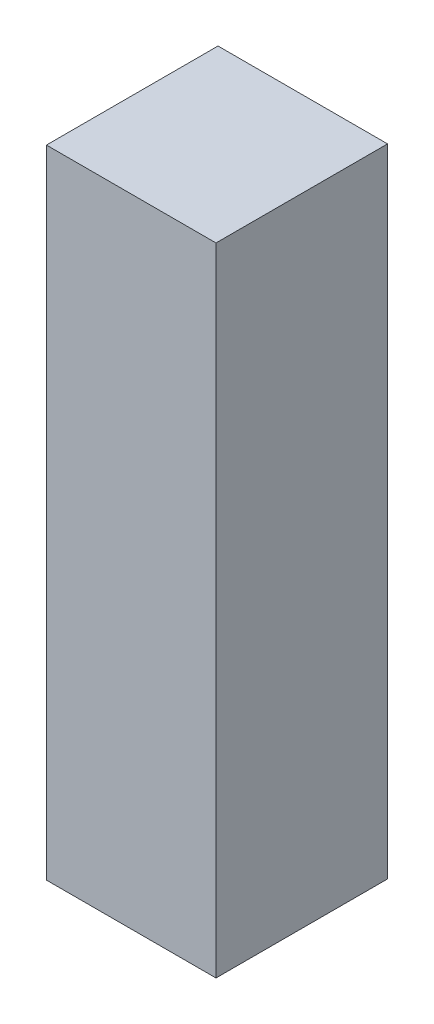
ISO-10303-21;
HEADER;
FILE_DESCRIPTION(('STEP AP214'),'2;1');
FILE_NAME('part.step','',(''),(''),'','','');
FILE_SCHEMA(('AUTOMOTIVE_DESIGN { 1 0 10303 214 1 1 1 1 }'));
ENDSEC;
DATA;
#1=APPLICATION_CONTEXT('core data for automotive mechanical design processes');
#2=APPLICATION_PROTOCOL_DEFINITION('international standard','automotive_design',2000,#1);
#3=PRODUCT_CONTEXT('',#1,'mechanical');
#4=PRODUCT('Part','Part','',(#3));
#5=PRODUCT_RELATED_PRODUCT_CATEGORY('part','',(#4));
#6=PRODUCT_DEFINITION_FORMATION('','',#4);
#7=PRODUCT_DEFINITION_CONTEXT('part definition',#1,'design');
#8=PRODUCT_DEFINITION('design','',#6,#7);
#9=PRODUCT_DEFINITION_SHAPE('','',#8);
#10=(LENGTH_UNIT() NAMED_UNIT(*) SI_UNIT(.MILLI.,.METRE.));
#11=(NAMED_UNIT(*) PLANE_ANGLE_UNIT() SI_UNIT($,.RADIAN.));
#12=(NAMED_UNIT(*) SI_UNIT($,.STERADIAN.) SOLID_ANGLE_UNIT());
#13=UNCERTAINTY_MEASURE_WITH_UNIT(LENGTH_MEASURE(1.E-05),#10,'distance_accuracy_value','');
#14=(GEOMETRIC_REPRESENTATION_CONTEXT(3) GLOBAL_UNCERTAINTY_ASSIGNED_CONTEXT((#13)) GLOBAL_UNIT_ASSIGNED_CONTEXT((#10,
#11,#12)) REPRESENTATION_CONTEXT('',''));
#15=CARTESIAN_POINT('',(0.,0.,0.));
#16=DIRECTION('',(0.,0.,1.));
#17=DIRECTION('',(1.,0.,0.));
#18=AXIS2_PLACEMENT_3D('',#15,#16,#17);
#19=CARTESIAN_POINT('',(10.16,43.556246407511,18.9405834941848));
#20=DIRECTION('',(0.,0.,-1.));
#21=DIRECTION('',(-1.,0.,0.));
#22=AXIS2_PLACEMENT_3D('',#19,#20,#21);
#23=PLANE('',#22);
#24=DIRECTION('',(0.,-1.,0.));
#25=VECTOR('',#24,1.);
#26=CARTESIAN_POINT('',(0.,43.556246407511,18.9405834941848));
#27=LINE('',#26,#25);
#28=CARTESIAN_POINT('',(0.,43.556246407511,18.9405834941848));
#29=VERTEX_POINT('',#28);
#30=CARTESIAN_POINT('',(0.,5.41071383944235,18.9405834941848));
#31=VERTEX_POINT('',#30);
#32=EDGE_CURVE('E96',#29,#31,#27,.T.);
#33=ORIENTED_EDGE('',*,*,#32,.T.);
#34=DIRECTION('',(-1.,0.,0.));
#35=VECTOR('',#34,1.);
#36=CARTESIAN_POINT('',(10.16,5.41071383944235,18.9405834941848));
#37=LINE('',#36,#35);
#38=CARTESIAN_POINT('',(10.16,5.41071383944235,18.9405834941848));
#39=VERTEX_POINT('',#38);
#40=EDGE_CURVE('E11',#39,#31,#37,.T.);
#41=ORIENTED_EDGE('',*,*,#40,.F.);
#42=DIRECTION('',(0.,-1.,0.));
#43=VECTOR('',#42,1.);
#44=CARTESIAN_POINT('',(10.16,43.556246407511,18.9405834941848));
#45=LINE('',#44,#43);
#46=CARTESIAN_POINT('',(10.16,43.556246407511,18.9405834941848));
#47=VERTEX_POINT('',#46);
#48=EDGE_CURVE('E84',#47,#39,#45,.T.);
#49=ORIENTED_EDGE('',*,*,#48,.F.);
#50=DIRECTION('',(-1.,0.,0.));
#51=VECTOR('',#50,1.);
#52=CARTESIAN_POINT('',(10.16,43.556246407511,18.9405834941848));
#53=LINE('',#52,#51);
#54=EDGE_CURVE('E92',#47,#29,#53,.T.);
#55=ORIENTED_EDGE('',*,*,#54,.T.);
#56=EDGE_LOOP('',(#33,#41,#49,#55));
#57=FACE_BOUND('',#56,.T.);
#58=ADVANCED_FACE('F33',(#57),#23,.F.);
#59=CARTESIAN_POINT('',(10.16,5.41071383944235,18.9405834941848));
#60=DIRECTION('',(0.,1.,0.));
#61=DIRECTION('',(0.,0.,1.));
#62=AXIS2_PLACEMENT_3D('',#59,#60,#61);
#63=PLANE('',#62);
#64=DIRECTION('',(0.,0.,-1.));
#65=VECTOR('',#64,1.);
#66=CARTESIAN_POINT('',(0.,5.41071383944235,18.9405834941848));
#67=LINE('',#66,#65);
#68=CARTESIAN_POINT('',(0.,5.41071383944235,8.66022719924431));
#69=VERTEX_POINT('',#68);
#70=EDGE_CURVE('E88',#31,#69,#67,.T.);
#71=ORIENTED_EDGE('',*,*,#70,.T.);
#72=DIRECTION('',(-1.,0.,0.));
#73=VECTOR('',#72,1.);
#74=CARTESIAN_POINT('',(10.16,5.41071383944235,8.66022719924431));
#75=LINE('',#74,#73);
#76=CARTESIAN_POINT('',(10.16,5.41071383944235,8.66022719924431));
#77=VERTEX_POINT('',#76);
#78=EDGE_CURVE('E41',#77,#69,#75,.T.);
#79=ORIENTED_EDGE('',*,*,#78,.F.);
#80=DIRECTION('',(0.,0.,-1.));
#81=VECTOR('',#80,1.);
#82=CARTESIAN_POINT('',(10.16,5.41071383944235,18.9405834941848));
#83=LINE('',#82,#81);
#84=EDGE_CURVE('E79',#39,#77,#83,.T.);
#85=ORIENTED_EDGE('',*,*,#84,.F.);
#86=ORIENTED_EDGE('',*,*,#40,.T.);
#87=EDGE_LOOP('',(#71,#79,#85,#86));
#88=FACE_BOUND('',#87,.T.);
#89=ADVANCED_FACE('F87',(#88),#63,.F.);
#90=CARTESIAN_POINT('',(10.16,43.556246407511,8.66022719924431));
#91=DIRECTION('',(0.,0.,1.));
#92=DIRECTION('',(1.,0.,0.));
#93=AXIS2_PLACEMENT_3D('',#90,#91,#92);
#94=PLANE('',#93);
#95=DIRECTION('',(0.,1.,0.));
#96=VECTOR('',#95,1.);
#97=CARTESIAN_POINT('',(0.,43.556246407511,8.66022719924431));
#98=LINE('',#97,#96);
#99=CARTESIAN_POINT('',(0.,43.556246407511,8.66022719924431));
#100=VERTEX_POINT('',#99);
#101=EDGE_CURVE('E66',#69,#100,#98,.T.);
#102=ORIENTED_EDGE('',*,*,#101,.T.);
#103=DIRECTION('',(-1.,0.,0.));
#104=VECTOR('',#103,1.);
#105=CARTESIAN_POINT('',(10.16,43.556246407511,8.66022719924431));
#106=LINE('',#105,#104);
#107=CARTESIAN_POINT('',(10.16,43.556246407511,8.66022719924431));
#108=VERTEX_POINT('',#107);
#109=EDGE_CURVE('E89',#108,#100,#106,.T.);
#110=ORIENTED_EDGE('',*,*,#109,.F.);
#111=DIRECTION('',(0.,1.,0.));
#112=VECTOR('',#111,1.);
#113=CARTESIAN_POINT('',(10.16,43.556246407511,8.66022719924431));
#114=LINE('',#113,#112);
#115=EDGE_CURVE('E82',#77,#108,#114,.T.);
#116=ORIENTED_EDGE('',*,*,#115,.F.);
#117=ORIENTED_EDGE('',*,*,#78,.T.);
#118=EDGE_LOOP('',(#102,#110,#116,#117));
#119=FACE_BOUND('',#118,.T.);
#120=ADVANCED_FACE('F90',(#119),#94,.F.);
#121=CARTESIAN_POINT('',(10.16,43.556246407511,18.9405834941848));
#122=DIRECTION('',(0.,-1.,0.));
#123=DIRECTION('',(0.,0.,-1.));
#124=AXIS2_PLACEMENT_3D('',#121,#122,#123);
#125=PLANE('',#124);
#126=DIRECTION('',(0.,0.,1.));
#127=VECTOR('',#126,1.);
#128=CARTESIAN_POINT('',(0.,43.556246407511,18.9405834941848));
#129=LINE('',#128,#127);
#130=EDGE_CURVE('E72',#100,#29,#129,.T.);
#131=ORIENTED_EDGE('',*,*,#130,.T.);
#132=ORIENTED_EDGE('',*,*,#54,.F.);
#133=DIRECTION('',(0.,0.,1.));
#134=VECTOR('',#133,1.);
#135=CARTESIAN_POINT('',(10.16,43.556246407511,18.9405834941848));
#136=LINE('',#135,#134);
#137=EDGE_CURVE('E49',#108,#47,#136,.T.);
#138=ORIENTED_EDGE('',*,*,#137,.F.);
#139=ORIENTED_EDGE('',*,*,#109,.T.);
#140=EDGE_LOOP('',(#131,#132,#138,#139));
#141=FACE_BOUND('',#140,.T.);
#142=ADVANCED_FACE('F103',(#141),#125,.F.);
#143=CARTESIAN_POINT('',(10.16,0.,0.));
#144=DIRECTION('',(1.,0.,0.));
#145=DIRECTION('',(0.,0.,-1.));
#146=AXIS2_PLACEMENT_3D('',#143,#144,#145);
#147=PLANE('',#146);
#148=ORIENTED_EDGE('',*,*,#48,.T.);
#149=ORIENTED_EDGE('',*,*,#84,.T.);
#150=ORIENTED_EDGE('',*,*,#115,.T.);
#151=ORIENTED_EDGE('',*,*,#137,.T.);
#152=EDGE_LOOP('',(#148,#149,#150,#151));
#153=FACE_BOUND('',#152,.T.);
#154=ADVANCED_FACE('F80',(#153),#147,.T.);
#155=CARTESIAN_POINT('',(0.,0.,0.));
#156=DIRECTION('',(1.,0.,0.));
#157=DIRECTION('',(0.,0.,-1.));
#158=AXIS2_PLACEMENT_3D('',#155,#156,#157);
#159=PLANE('',#158);
#160=ORIENTED_EDGE('',*,*,#32,.F.);
#161=ORIENTED_EDGE('',*,*,#130,.F.);
#162=ORIENTED_EDGE('',*,*,#101,.F.);
#163=ORIENTED_EDGE('',*,*,#70,.F.);
#164=EDGE_LOOP('',(#160,#161,#162,#163));
#165=FACE_BOUND('',#164,.T.);
#166=ADVANCED_FACE('F106',(#165),#159,.F.);
#167=CLOSED_SHELL('',(#58,#89,#120,#142,#154,#166));
#168=MANIFOLD_SOLID_BREP('B2',#167);
#169=ADVANCED_BREP_SHAPE_REPRESENTATION('',(#18,#168),#14);
#170=SHAPE_DEFINITION_REPRESENTATION(#9,#169);
ENDSEC;
END-ISO-10303-21;
